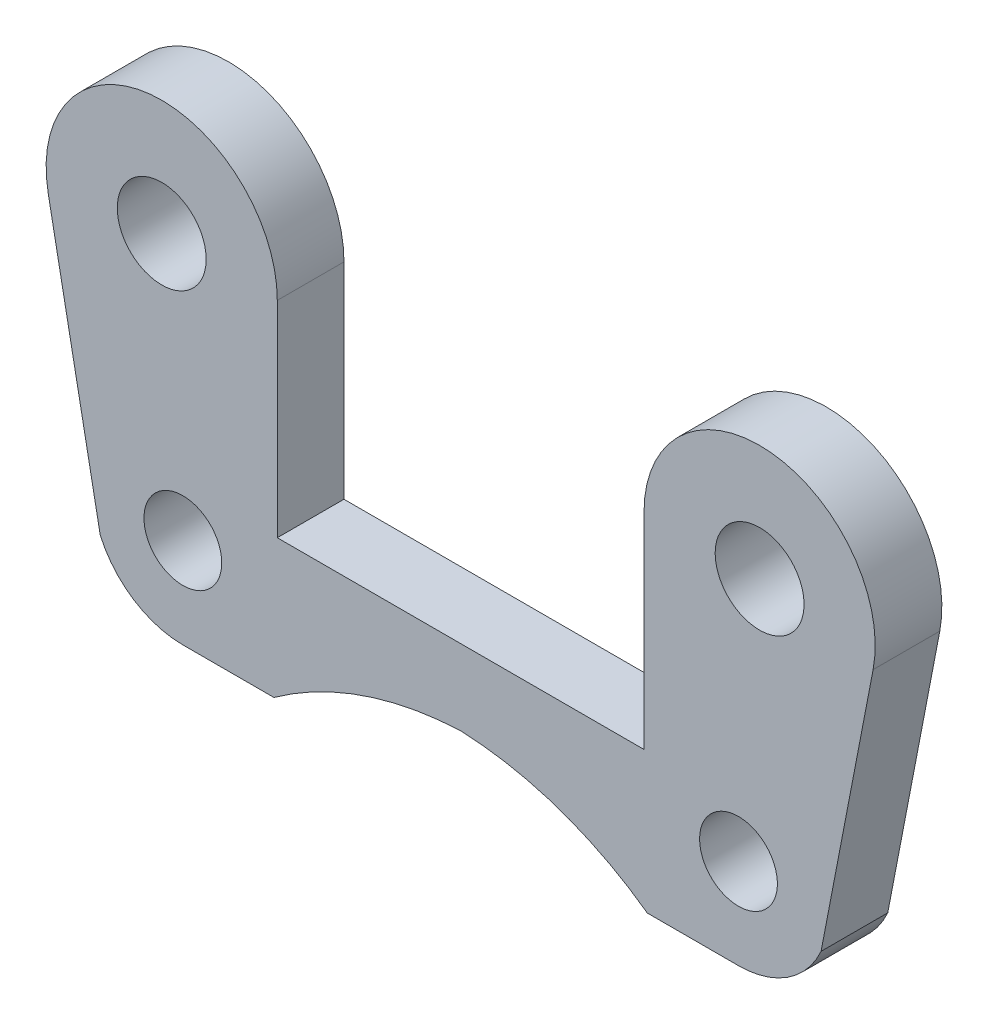
ISO-10303-21;
HEADER;
FILE_DESCRIPTION(('STEP AP214'),'2;1');
FILE_NAME('part.step','',(''),(''),'','','');
FILE_SCHEMA(('AUTOMOTIVE_DESIGN { 1 0 10303 214 1 1 1 1 }'));
ENDSEC;
DATA;
#1=APPLICATION_CONTEXT('core data for automotive mechanical design processes');
#2=APPLICATION_PROTOCOL_DEFINITION('international standard','automotive_design',2000,#1);
#3=PRODUCT_CONTEXT('',#1,'mechanical');
#4=PRODUCT('Part','Part','',(#3));
#5=PRODUCT_RELATED_PRODUCT_CATEGORY('part','',(#4));
#6=PRODUCT_DEFINITION_FORMATION('','',#4);
#7=PRODUCT_DEFINITION_CONTEXT('part definition',#1,'design');
#8=PRODUCT_DEFINITION('design','',#6,#7);
#9=PRODUCT_DEFINITION_SHAPE('','',#8);
#10=(LENGTH_UNIT() NAMED_UNIT(*) SI_UNIT(.MILLI.,.METRE.));
#11=(NAMED_UNIT(*) PLANE_ANGLE_UNIT() SI_UNIT($,.RADIAN.));
#12=(NAMED_UNIT(*) SI_UNIT($,.STERADIAN.) SOLID_ANGLE_UNIT());
#13=UNCERTAINTY_MEASURE_WITH_UNIT(LENGTH_MEASURE(1.E-05),#10,'distance_accuracy_value','');
#14=(GEOMETRIC_REPRESENTATION_CONTEXT(3) GLOBAL_UNCERTAINTY_ASSIGNED_CONTEXT((#13)) GLOBAL_UNIT_ASSIGNED_CONTEXT((#10,
#11,#12)) REPRESENTATION_CONTEXT('',''));
#15=CARTESIAN_POINT('',(0.,0.,0.));
#16=DIRECTION('',(0.,0.,1.));
#17=DIRECTION('',(1.,0.,0.));
#18=AXIS2_PLACEMENT_3D('',#15,#16,#17);
#19=CARTESIAN_POINT('',(-25.,-33.3691985578076,6.));
#20=DIRECTION('',(0.,0.,-1.));
#21=DIRECTION('',(-1.,0.,0.));
#22=AXIS2_PLACEMENT_3D('',#19,#20,#21);
#23=PLANE('',#22);
#24=CARTESIAN_POINT('',(-25.,-33.3691985578076,6.));
#25=DIRECTION('',(0.,0.,1.));
#26=DIRECTION('',(-1.,0.,0.));
#27=AXIS2_PLACEMENT_3D('',#24,#25,#26);
#28=CIRCLE('',#27,8.13080144219235);
#29=CARTESIAN_POINT('',(-32.431413249492,-36.6682937682604,6.));
#30=VERTEX_POINT('',#29);
#31=CARTESIAN_POINT('',(-25.,-41.5,6.));
#32=VERTEX_POINT('',#31);
#33=EDGE_CURVE('E185',#30,#32,#28,.T.);
#34=ORIENTED_EDGE('',*,*,#33,.T.);
#35=DIRECTION('',(1.,0.,0.));
#36=VECTOR('',#35,1.);
#37=CARTESIAN_POINT('',(-25.,-41.5,6.));
#38=LINE('',#37,#36);
#39=CARTESIAN_POINT('',(-16.8,-41.5,6.));
#40=VERTEX_POINT('',#39);
#41=EDGE_CURVE('E108',#32,#40,#38,.T.);
#42=ORIENTED_EDGE('',*,*,#41,.T.);
#43=CARTESIAN_POINT('',(1.20231787931905,-66.4136104090621,6.));
#44=DIRECTION('',(0.,0.,-1.));
#45=DIRECTION('',(1.,0.,0.));
#46=AXIS2_PLACEMENT_3D('',#43,#44,#45);
#47=CIRCLE('',#46,30.7371344247081);
#48=CARTESIAN_POINT('',(0.,-35.7,6.));
#49=VERTEX_POINT('',#48);
#50=EDGE_CURVE('E215',#40,#49,#47,.T.);
#51=ORIENTED_EDGE('',*,*,#50,.T.);
#52=CARTESIAN_POINT('',(-1.20231787931903,-66.4136104090621,6.));
#53=DIRECTION('',(0.,0.,-1.));
#54=DIRECTION('',(-1.,0.,0.));
#55=AXIS2_PLACEMENT_3D('',#52,#53,#54);
#56=CIRCLE('',#55,30.7371344247081);
#57=CARTESIAN_POINT('',(16.8,-41.5,6.));
#58=VERTEX_POINT('',#57);
#59=EDGE_CURVE('E234',#49,#58,#56,.T.);
#60=ORIENTED_EDGE('',*,*,#59,.T.);
#61=DIRECTION('',(1.,0.,0.));
#62=VECTOR('',#61,1.);
#63=CARTESIAN_POINT('',(25.,-41.5,6.));
#64=LINE('',#63,#62);
#65=CARTESIAN_POINT('',(25.,-41.5,6.));
#66=VERTEX_POINT('',#65);
#67=EDGE_CURVE('E231',#58,#66,#64,.T.);
#68=ORIENTED_EDGE('',*,*,#67,.T.);
#69=CARTESIAN_POINT('',(25.,-33.3691985578076,6.));
#70=DIRECTION('',(0.,0.,1.));
#71=DIRECTION('',(1.,0.,0.));
#72=AXIS2_PLACEMENT_3D('',#69,#70,#71);
#73=CIRCLE('',#72,8.13080144219235);
#74=CARTESIAN_POINT('',(32.431413249492,-36.6682937682604,6.));
#75=VERTEX_POINT('',#74);
#76=EDGE_CURVE('E233',#66,#75,#73,.T.);
#77=ORIENTED_EDGE('',*,*,#76,.T.);
#78=DIRECTION('',(0.189286162263998,0.98192196674449,0.));
#79=VECTOR('',#78,1.);
#80=CARTESIAN_POINT('',(32.431413249492,-36.6682937682604,6.));
#81=LINE('',#80,#79);
#82=CARTESIAN_POINT('',(37.1153117515257,-12.3705702889606,6.));
#83=VERTEX_POINT('',#82);
#84=EDGE_CURVE('E236',#75,#83,#81,.T.);
#85=ORIENTED_EDGE('',*,*,#84,.T.);
#86=CARTESIAN_POINT('',(26.901676805363,-10.401676805363,6.));
#87=DIRECTION('',(0.,0.,1.));
#88=DIRECTION('',(1.,0.,0.));
#89=AXIS2_PLACEMENT_3D('',#86,#87,#88);
#90=CIRCLE('',#89,10.401676805363);
#91=CARTESIAN_POINT('',(16.5,-10.401676805363,6.));
#92=VERTEX_POINT('',#91);
#93=EDGE_CURVE('E242',#83,#92,#90,.T.);
#94=ORIENTED_EDGE('',*,*,#93,.T.);
#95=DIRECTION('',(0.,-1.,0.));
#96=VECTOR('',#95,1.);
#97=CARTESIAN_POINT('',(16.5,-28.9,6.));
#98=LINE('',#97,#96);
#99=CARTESIAN_POINT('',(16.5,-28.9,6.));
#100=VERTEX_POINT('',#99);
#101=EDGE_CURVE('E244',#92,#100,#98,.T.);
#102=ORIENTED_EDGE('',*,*,#101,.T.);
#103=DIRECTION('',(-1.,0.,0.));
#104=VECTOR('',#103,1.);
#105=CARTESIAN_POINT('',(-16.5,-28.9,6.));
#106=LINE('',#105,#104);
#107=CARTESIAN_POINT('',(-16.5,-28.9,6.));
#108=VERTEX_POINT('',#107);
#109=EDGE_CURVE('E142',#100,#108,#106,.T.);
#110=ORIENTED_EDGE('',*,*,#109,.T.);
#111=DIRECTION('',(0.,1.,0.));
#112=VECTOR('',#111,1.);
#113=CARTESIAN_POINT('',(-16.5,-28.9,6.));
#114=LINE('',#113,#112);
#115=CARTESIAN_POINT('',(-16.5,-10.401676805363,6.));
#116=VERTEX_POINT('',#115);
#117=EDGE_CURVE('E136',#108,#116,#114,.T.);
#118=ORIENTED_EDGE('',*,*,#117,.T.);
#119=CARTESIAN_POINT('',(-26.901676805363,-10.401676805363,6.));
#120=DIRECTION('',(0.,0.,1.));
#121=DIRECTION('',(-1.,0.,0.));
#122=AXIS2_PLACEMENT_3D('',#119,#120,#121);
#123=CIRCLE('',#122,10.401676805363);
#124=CARTESIAN_POINT('',(-37.1153117515257,-12.3705702889606,6.));
#125=VERTEX_POINT('',#124);
#126=EDGE_CURVE('E140',#116,#125,#123,.T.);
#127=ORIENTED_EDGE('',*,*,#126,.T.);
#128=DIRECTION('',(0.189286162263998,-0.98192196674449,0.));
#129=VECTOR('',#128,1.);
#130=CARTESIAN_POINT('',(-32.431413249492,-36.6682937682604,6.));
#131=LINE('',#130,#129);
#132=EDGE_CURVE('E50',#125,#30,#131,.T.);
#133=ORIENTED_EDGE('',*,*,#132,.T.);
#134=EDGE_LOOP('',(#34,#42,#51,#60,#68,#77,#85,#94,#102,#110,#118,#127,#133));
#135=FACE_BOUND('',#134,.T.);
#136=CARTESIAN_POINT('',(-25.,-33.3691985578076,6.));
#137=DIRECTION('',(0.,0.,1.));
#138=DIRECTION('',(1.,0.,0.));
#139=AXIS2_PLACEMENT_3D('',#136,#137,#138);
#140=CIRCLE('',#139,3.5);
#141=CARTESIAN_POINT('',(-21.5,-33.3691985578076,6.));
#142=VERTEX_POINT('',#141);
#143=EDGE_CURVE('E164',#142,#142,#140,.T.);
#144=ORIENTED_EDGE('',*,*,#143,.F.);
#145=EDGE_LOOP('',(#144));
#146=FACE_BOUND('',#145,.T.);
#147=CARTESIAN_POINT('',(-26.901676805363,-10.401676805363,6.));
#148=DIRECTION('',(0.,0.,1.));
#149=DIRECTION('',(1.,0.,0.));
#150=AXIS2_PLACEMENT_3D('',#147,#148,#149);
#151=CIRCLE('',#150,4.);
#152=CARTESIAN_POINT('',(-22.901676805363,-10.401676805363,6.));
#153=VERTEX_POINT('',#152);
#154=EDGE_CURVE('E308',#153,#153,#151,.T.);
#155=ORIENTED_EDGE('',*,*,#154,.F.);
#156=EDGE_LOOP('',(#155));
#157=FACE_BOUND('',#156,.T.);
#158=CARTESIAN_POINT('',(25.,-33.3691985578076,6.));
#159=DIRECTION('',(0.,0.,1.));
#160=DIRECTION('',(-1.,0.,0.));
#161=AXIS2_PLACEMENT_3D('',#158,#159,#160);
#162=CIRCLE('',#161,3.5);
#163=CARTESIAN_POINT('',(21.5,-33.3691985578076,6.));
#164=VERTEX_POINT('',#163);
#165=EDGE_CURVE('E302',#164,#164,#162,.T.);
#166=ORIENTED_EDGE('',*,*,#165,.F.);
#167=EDGE_LOOP('',(#166));
#168=FACE_BOUND('',#167,.T.);
#169=CARTESIAN_POINT('',(26.901676805363,-10.401676805363,6.));
#170=DIRECTION('',(0.,0.,1.));
#171=DIRECTION('',(-1.,0.,0.));
#172=AXIS2_PLACEMENT_3D('',#169,#170,#171);
#173=CIRCLE('',#172,4.);
#174=CARTESIAN_POINT('',(22.901676805363,-10.401676805363,6.));
#175=VERTEX_POINT('',#174);
#176=EDGE_CURVE('E293',#175,#175,#173,.T.);
#177=ORIENTED_EDGE('',*,*,#176,.F.);
#178=EDGE_LOOP('',(#177));
#179=FACE_BOUND('',#178,.T.);
#180=ADVANCED_FACE('F33',(#135,#146,#157,#168,#179),#23,.F.);
#181=CARTESIAN_POINT('',(-25.,-33.3691985578076,0.));
#182=DIRECTION('',(0.,0.,-1.));
#183=DIRECTION('',(-1.,0.,0.));
#184=AXIS2_PLACEMENT_3D('',#181,#182,#183);
#185=PLANE('',#184);
#186=CARTESIAN_POINT('',(25.,-33.3691985578076,0.));
#187=DIRECTION('',(0.,0.,1.));
#188=DIRECTION('',(-1.,0.,0.));
#189=AXIS2_PLACEMENT_3D('',#186,#187,#188);
#190=CIRCLE('',#189,3.5);
#191=CARTESIAN_POINT('',(21.5,-33.3691985578076,0.));
#192=VERTEX_POINT('',#191);
#193=EDGE_CURVE('E299',#192,#192,#190,.T.);
#194=ORIENTED_EDGE('',*,*,#193,.T.);
#195=EDGE_LOOP('',(#194));
#196=FACE_BOUND('',#195,.T.);
#197=CARTESIAN_POINT('',(-25.,-33.3691985578076,0.));
#198=DIRECTION('',(0.,0.,1.));
#199=DIRECTION('',(1.,0.,0.));
#200=AXIS2_PLACEMENT_3D('',#197,#198,#199);
#201=CIRCLE('',#200,3.5);
#202=CARTESIAN_POINT('',(-21.5,-33.3691985578076,0.));
#203=VERTEX_POINT('',#202);
#204=EDGE_CURVE('E311',#203,#203,#201,.T.);
#205=ORIENTED_EDGE('',*,*,#204,.T.);
#206=EDGE_LOOP('',(#205));
#207=FACE_BOUND('',#206,.T.);
#208=CARTESIAN_POINT('',(-25.,-33.3691985578076,0.));
#209=DIRECTION('',(0.,0.,1.));
#210=DIRECTION('',(-1.,0.,0.));
#211=AXIS2_PLACEMENT_3D('',#208,#209,#210);
#212=CIRCLE('',#211,8.13080144219235);
#213=CARTESIAN_POINT('',(-32.431413249492,-36.6682937682604,0.));
#214=VERTEX_POINT('',#213);
#215=CARTESIAN_POINT('',(-25.,-41.5,0.));
#216=VERTEX_POINT('',#215);
#217=EDGE_CURVE('E160',#214,#216,#212,.T.);
#218=ORIENTED_EDGE('',*,*,#217,.F.);
#219=DIRECTION('',(0.189286162263998,-0.98192196674449,0.));
#220=VECTOR('',#219,1.);
#221=CARTESIAN_POINT('',(-32.431413249492,-36.6682937682604,0.));
#222=LINE('',#221,#220);
#223=CARTESIAN_POINT('',(-37.1153117515257,-12.3705702889606,0.));
#224=VERTEX_POINT('',#223);
#225=EDGE_CURVE('E100',#224,#214,#222,.T.);
#226=ORIENTED_EDGE('',*,*,#225,.F.);
#227=CARTESIAN_POINT('',(-26.901676805363,-10.401676805363,0.));
#228=DIRECTION('',(0.,0.,1.));
#229=DIRECTION('',(-1.,0.,0.));
#230=AXIS2_PLACEMENT_3D('',#227,#228,#229);
#231=CIRCLE('',#230,10.401676805363);
#232=CARTESIAN_POINT('',(-16.5,-10.401676805363,0.));
#233=VERTEX_POINT('',#232);
#234=EDGE_CURVE('E94',#233,#224,#231,.T.);
#235=ORIENTED_EDGE('',*,*,#234,.F.);
#236=DIRECTION('',(0.,1.,0.));
#237=VECTOR('',#236,1.);
#238=CARTESIAN_POINT('',(-16.5,-28.9,0.));
#239=LINE('',#238,#237);
#240=CARTESIAN_POINT('',(-16.5,-28.9,0.));
#241=VERTEX_POINT('',#240);
#242=EDGE_CURVE('E150',#241,#233,#239,.T.);
#243=ORIENTED_EDGE('',*,*,#242,.F.);
#244=DIRECTION('',(-1.,0.,0.));
#245=VECTOR('',#244,1.);
#246=CARTESIAN_POINT('',(-16.5,-28.9,0.));
#247=LINE('',#246,#245);
#248=CARTESIAN_POINT('',(16.5,-28.9,0.));
#249=VERTEX_POINT('',#248);
#250=EDGE_CURVE('E180',#249,#241,#247,.T.);
#251=ORIENTED_EDGE('',*,*,#250,.F.);
#252=DIRECTION('',(0.,-1.,0.));
#253=VECTOR('',#252,1.);
#254=CARTESIAN_POINT('',(16.5,-28.9,0.));
#255=LINE('',#254,#253);
#256=CARTESIAN_POINT('',(16.5,-10.401676805363,0.));
#257=VERTEX_POINT('',#256);
#258=EDGE_CURVE('E178',#257,#249,#255,.T.);
#259=ORIENTED_EDGE('',*,*,#258,.F.);
#260=CARTESIAN_POINT('',(26.901676805363,-10.401676805363,0.));
#261=DIRECTION('',(0.,0.,1.));
#262=DIRECTION('',(1.,0.,0.));
#263=AXIS2_PLACEMENT_3D('',#260,#261,#262);
#264=CIRCLE('',#263,10.401676805363);
#265=CARTESIAN_POINT('',(37.1153117515257,-12.3705702889606,0.));
#266=VERTEX_POINT('',#265);
#267=EDGE_CURVE('E176',#266,#257,#264,.T.);
#268=ORIENTED_EDGE('',*,*,#267,.F.);
#269=DIRECTION('',(0.189286162263998,0.98192196674449,0.));
#270=VECTOR('',#269,1.);
#271=CARTESIAN_POINT('',(32.431413249492,-36.6682937682604,0.));
#272=LINE('',#271,#270);
#273=CARTESIAN_POINT('',(32.431413249492,-36.6682937682604,0.));
#274=VERTEX_POINT('',#273);
#275=EDGE_CURVE('E174',#274,#266,#272,.T.);
#276=ORIENTED_EDGE('',*,*,#275,.F.);
#277=CARTESIAN_POINT('',(25.,-33.3691985578076,0.));
#278=DIRECTION('',(0.,0.,1.));
#279=DIRECTION('',(1.,0.,0.));
#280=AXIS2_PLACEMENT_3D('',#277,#278,#279);
#281=CIRCLE('',#280,8.13080144219235);
#282=CARTESIAN_POINT('',(25.,-41.5,0.));
#283=VERTEX_POINT('',#282);
#284=EDGE_CURVE('E172',#283,#274,#281,.T.);
#285=ORIENTED_EDGE('',*,*,#284,.F.);
#286=DIRECTION('',(1.,0.,0.));
#287=VECTOR('',#286,1.);
#288=CARTESIAN_POINT('',(25.,-41.5,0.));
#289=LINE('',#288,#287);
#290=CARTESIAN_POINT('',(16.8,-41.5,0.));
#291=VERTEX_POINT('',#290);
#292=EDGE_CURVE('E170',#291,#283,#289,.T.);
#293=ORIENTED_EDGE('',*,*,#292,.F.);
#294=CARTESIAN_POINT('',(-1.20231787931903,-66.4136104090621,0.));
#295=DIRECTION('',(0.,0.,-1.));
#296=DIRECTION('',(-1.,0.,0.));
#297=AXIS2_PLACEMENT_3D('',#294,#295,#296);
#298=CIRCLE('',#297,30.7371344247081);
#299=CARTESIAN_POINT('',(0.,-35.7,0.));
#300=VERTEX_POINT('',#299);
#301=EDGE_CURVE('E168',#300,#291,#298,.T.);
#302=ORIENTED_EDGE('',*,*,#301,.F.);
#303=CARTESIAN_POINT('',(1.20231787931905,-66.4136104090621,0.));
#304=DIRECTION('',(0.,0.,-1.));
#305=DIRECTION('',(1.,0.,0.));
#306=AXIS2_PLACEMENT_3D('',#303,#304,#305);
#307=CIRCLE('',#306,30.7371344247081);
#308=CARTESIAN_POINT('',(-16.8,-41.5,0.));
#309=VERTEX_POINT('',#308);
#310=EDGE_CURVE('E166',#309,#300,#307,.T.);
#311=ORIENTED_EDGE('',*,*,#310,.F.);
#312=DIRECTION('',(1.,0.,0.));
#313=VECTOR('',#312,1.);
#314=CARTESIAN_POINT('',(-25.,-41.5,0.));
#315=LINE('',#314,#313);
#316=EDGE_CURVE('E163',#216,#309,#315,.T.);
#317=ORIENTED_EDGE('',*,*,#316,.F.);
#318=EDGE_LOOP('',(#218,#226,#235,#243,#251,#259,#268,#276,#285,#293,#302,#311,#317));
#319=FACE_BOUND('',#318,.T.);
#320=CARTESIAN_POINT('',(-26.901676805363,-10.401676805363,0.));
#321=DIRECTION('',(0.,0.,1.));
#322=DIRECTION('',(1.,0.,0.));
#323=AXIS2_PLACEMENT_3D('',#320,#321,#322);
#324=CIRCLE('',#323,4.);
#325=CARTESIAN_POINT('',(-22.901676805363,-10.401676805363,0.));
#326=VERTEX_POINT('',#325);
#327=EDGE_CURVE('E305',#326,#326,#324,.T.);
#328=ORIENTED_EDGE('',*,*,#327,.T.);
#329=EDGE_LOOP('',(#328));
#330=FACE_BOUND('',#329,.T.);
#331=CARTESIAN_POINT('',(26.901676805363,-10.401676805363,0.));
#332=DIRECTION('',(0.,0.,1.));
#333=DIRECTION('',(-1.,0.,0.));
#334=AXIS2_PLACEMENT_3D('',#331,#332,#333);
#335=CIRCLE('',#334,4.);
#336=CARTESIAN_POINT('',(22.901676805363,-10.401676805363,0.));
#337=VERTEX_POINT('',#336);
#338=EDGE_CURVE('E296',#337,#337,#335,.T.);
#339=ORIENTED_EDGE('',*,*,#338,.T.);
#340=EDGE_LOOP('',(#339));
#341=FACE_BOUND('',#340,.T.);
#342=ADVANCED_FACE('F219',(#196,#207,#319,#330,#341),#185,.T.);
#343=CARTESIAN_POINT('',(-25.,-33.3691985578076,6.));
#344=DIRECTION('',(0.,0.,-1.));
#345=DIRECTION('',(-1.,0.,0.));
#346=AXIS2_PLACEMENT_3D('',#343,#344,#345);
#347=CYLINDRICAL_SURFACE('',#346,8.13080144219235);
#348=ORIENTED_EDGE('',*,*,#217,.T.);
#349=DIRECTION('',(0.,0.,-1.));
#350=VECTOR('',#349,1.);
#351=CARTESIAN_POINT('',(-25.,-41.5,6.));
#352=LINE('',#351,#350);
#353=EDGE_CURVE('E11',#32,#216,#352,.T.);
#354=ORIENTED_EDGE('',*,*,#353,.F.);
#355=ORIENTED_EDGE('',*,*,#33,.F.);
#356=DIRECTION('',(0.,0.,-1.));
#357=VECTOR('',#356,1.);
#358=CARTESIAN_POINT('',(-32.431413249492,-36.6682937682604,6.));
#359=LINE('',#358,#357);
#360=EDGE_CURVE('E156',#30,#214,#359,.T.);
#361=ORIENTED_EDGE('',*,*,#360,.T.);
#362=EDGE_LOOP('',(#348,#354,#355,#361));
#363=FACE_BOUND('',#362,.T.);
#364=ADVANCED_FACE('F35',(#363),#347,.T.);
#365=CARTESIAN_POINT('',(-25.,-41.5,6.));
#366=DIRECTION('',(0.,1.,0.));
#367=DIRECTION('',(0.,0.,1.));
#368=AXIS2_PLACEMENT_3D('',#365,#366,#367);
#369=PLANE('',#368);
#370=ORIENTED_EDGE('',*,*,#316,.T.);
#371=DIRECTION('',(0.,0.,-1.));
#372=VECTOR('',#371,1.);
#373=CARTESIAN_POINT('',(-16.8,-41.5,6.));
#374=LINE('',#373,#372);
#375=EDGE_CURVE('E42',#40,#309,#374,.T.);
#376=ORIENTED_EDGE('',*,*,#375,.F.);
#377=ORIENTED_EDGE('',*,*,#41,.F.);
#378=ORIENTED_EDGE('',*,*,#353,.T.);
#379=EDGE_LOOP('',(#370,#376,#377,#378));
#380=FACE_BOUND('',#379,.T.);
#381=ADVANCED_FACE('F433',(#380),#369,.F.);
#382=CARTESIAN_POINT('',(1.20231787931905,-66.4136104090621,6.));
#383=DIRECTION('',(0.,0.,-1.));
#384=DIRECTION('',(-1.,0.,0.));
#385=AXIS2_PLACEMENT_3D('',#382,#383,#384);
#386=CYLINDRICAL_SURFACE('',#385,30.7371344247081);
#387=ORIENTED_EDGE('',*,*,#310,.T.);
#388=DIRECTION('',(0.,0.,-1.));
#389=VECTOR('',#388,1.);
#390=CARTESIAN_POINT('',(0.,-35.7,6.));
#391=LINE('',#390,#389);
#392=EDGE_CURVE('E207',#49,#300,#391,.T.);
#393=ORIENTED_EDGE('',*,*,#392,.F.);
#394=ORIENTED_EDGE('',*,*,#50,.F.);
#395=ORIENTED_EDGE('',*,*,#375,.T.);
#396=EDGE_LOOP('',(#387,#393,#394,#395));
#397=FACE_BOUND('',#396,.T.);
#398=ADVANCED_FACE('F213',(#397),#386,.F.);
#399=CARTESIAN_POINT('',(-1.20231787931903,-66.4136104090621,6.));
#400=DIRECTION('',(0.,0.,-1.));
#401=DIRECTION('',(-1.,0.,0.));
#402=AXIS2_PLACEMENT_3D('',#399,#400,#401);
#403=CYLINDRICAL_SURFACE('',#402,30.7371344247081);
#404=ORIENTED_EDGE('',*,*,#301,.T.);
#405=DIRECTION('',(0.,0.,-1.));
#406=VECTOR('',#405,1.);
#407=CARTESIAN_POINT('',(16.8,-41.5,6.));
#408=LINE('',#407,#406);
#409=EDGE_CURVE('E204',#58,#291,#408,.T.);
#410=ORIENTED_EDGE('',*,*,#409,.F.);
#411=ORIENTED_EDGE('',*,*,#59,.F.);
#412=ORIENTED_EDGE('',*,*,#392,.T.);
#413=EDGE_LOOP('',(#404,#410,#411,#412));
#414=FACE_BOUND('',#413,.T.);
#415=ADVANCED_FACE('F225',(#414),#403,.F.);
#416=CARTESIAN_POINT('',(25.,-41.5,6.));
#417=DIRECTION('',(0.,1.,0.));
#418=DIRECTION('',(-1.,0.,0.));
#419=AXIS2_PLACEMENT_3D('',#416,#417,#418);
#420=PLANE('',#419);
#421=ORIENTED_EDGE('',*,*,#292,.T.);
#422=DIRECTION('',(0.,0.,-1.));
#423=VECTOR('',#422,1.);
#424=CARTESIAN_POINT('',(25.,-41.5,6.));
#425=LINE('',#424,#423);
#426=EDGE_CURVE('E201',#66,#283,#425,.T.);
#427=ORIENTED_EDGE('',*,*,#426,.F.);
#428=ORIENTED_EDGE('',*,*,#67,.F.);
#429=ORIENTED_EDGE('',*,*,#409,.T.);
#430=EDGE_LOOP('',(#421,#427,#428,#429));
#431=FACE_BOUND('',#430,.T.);
#432=ADVANCED_FACE('F229',(#431),#420,.F.);
#433=CARTESIAN_POINT('',(25.,-33.3691985578076,6.));
#434=DIRECTION('',(0.,0.,-1.));
#435=DIRECTION('',(-1.,0.,0.));
#436=AXIS2_PLACEMENT_3D('',#433,#434,#435);
#437=CYLINDRICAL_SURFACE('',#436,8.13080144219235);
#438=ORIENTED_EDGE('',*,*,#284,.T.);
#439=DIRECTION('',(0.,0.,-1.));
#440=VECTOR('',#439,1.);
#441=CARTESIAN_POINT('',(32.431413249492,-36.6682937682604,6.));
#442=LINE('',#441,#440);
#443=EDGE_CURVE('E198',#75,#274,#442,.T.);
#444=ORIENTED_EDGE('',*,*,#443,.F.);
#445=ORIENTED_EDGE('',*,*,#76,.F.);
#446=ORIENTED_EDGE('',*,*,#426,.T.);
#447=EDGE_LOOP('',(#438,#444,#445,#446));
#448=FACE_BOUND('',#447,.T.);
#449=ADVANCED_FACE('F398',(#448),#437,.T.);
#450=CARTESIAN_POINT('',(32.431413249492,-36.6682937682604,6.));
#451=DIRECTION('',(-0.98192196674449,0.189286162263998,0.));
#452=DIRECTION('',(-0.189286162263998,-0.98192196674449,0.));
#453=AXIS2_PLACEMENT_3D('',#450,#451,#452);
#454=PLANE('',#453);
#455=ORIENTED_EDGE('',*,*,#275,.T.);
#456=DIRECTION('',(0.,0.,-1.));
#457=VECTOR('',#456,1.);
#458=CARTESIAN_POINT('',(37.1153117515257,-12.3705702889606,6.));
#459=LINE('',#458,#457);
#460=EDGE_CURVE('E195',#83,#266,#459,.T.);
#461=ORIENTED_EDGE('',*,*,#460,.F.);
#462=ORIENTED_EDGE('',*,*,#84,.F.);
#463=ORIENTED_EDGE('',*,*,#443,.T.);
#464=EDGE_LOOP('',(#455,#461,#462,#463));
#465=FACE_BOUND('',#464,.T.);
#466=ADVANCED_FACE('F388',(#465),#454,.F.);
#467=CARTESIAN_POINT('',(26.901676805363,-10.401676805363,6.));
#468=DIRECTION('',(0.,0.,-1.));
#469=DIRECTION('',(-1.,0.,0.));
#470=AXIS2_PLACEMENT_3D('',#467,#468,#469);
#471=CYLINDRICAL_SURFACE('',#470,10.401676805363);
#472=ORIENTED_EDGE('',*,*,#267,.T.);
#473=DIRECTION('',(0.,0.,-1.));
#474=VECTOR('',#473,1.);
#475=CARTESIAN_POINT('',(16.5,-10.401676805363,6.));
#476=LINE('',#475,#474);
#477=EDGE_CURVE('E192',#92,#257,#476,.T.);
#478=ORIENTED_EDGE('',*,*,#477,.F.);
#479=ORIENTED_EDGE('',*,*,#93,.F.);
#480=ORIENTED_EDGE('',*,*,#460,.T.);
#481=EDGE_LOOP('',(#472,#478,#479,#480));
#482=FACE_BOUND('',#481,.T.);
#483=ADVANCED_FACE('F379',(#482),#471,.T.);
#484=CARTESIAN_POINT('',(16.5,-28.9,6.));
#485=DIRECTION('',(1.,0.,0.));
#486=DIRECTION('',(0.,1.,0.));
#487=AXIS2_PLACEMENT_3D('',#484,#485,#486);
#488=PLANE('',#487);
#489=ORIENTED_EDGE('',*,*,#258,.T.);
#490=DIRECTION('',(0.,0.,-1.));
#491=VECTOR('',#490,1.);
#492=CARTESIAN_POINT('',(16.5,-28.9,6.));
#493=LINE('',#492,#491);
#494=EDGE_CURVE('E189',#100,#249,#493,.T.);
#495=ORIENTED_EDGE('',*,*,#494,.F.);
#496=ORIENTED_EDGE('',*,*,#101,.F.);
#497=ORIENTED_EDGE('',*,*,#477,.T.);
#498=EDGE_LOOP('',(#489,#495,#496,#497));
#499=FACE_BOUND('',#498,.T.);
#500=ADVANCED_FACE('F250',(#499),#488,.F.);
#501=CARTESIAN_POINT('',(-16.5,-28.9,6.));
#502=DIRECTION('',(0.,-1.,0.));
#503=DIRECTION('',(1.,0.,0.));
#504=AXIS2_PLACEMENT_3D('',#501,#502,#503);
#505=PLANE('',#504);
#506=ORIENTED_EDGE('',*,*,#250,.T.);
#507=DIRECTION('',(0.,0.,-1.));
#508=VECTOR('',#507,1.);
#509=CARTESIAN_POINT('',(-16.5,-28.9,6.));
#510=LINE('',#509,#508);
#511=EDGE_CURVE('E151',#108,#241,#510,.T.);
#512=ORIENTED_EDGE('',*,*,#511,.F.);
#513=ORIENTED_EDGE('',*,*,#109,.F.);
#514=ORIENTED_EDGE('',*,*,#494,.T.);
#515=EDGE_LOOP('',(#506,#512,#513,#514));
#516=FACE_BOUND('',#515,.T.);
#517=ADVANCED_FACE('F254',(#516),#505,.F.);
#518=CARTESIAN_POINT('',(-16.5,-28.9,6.));
#519=DIRECTION('',(-1.,0.,0.));
#520=DIRECTION('',(0.,-1.,0.));
#521=AXIS2_PLACEMENT_3D('',#518,#519,#520);
#522=PLANE('',#521);
#523=ORIENTED_EDGE('',*,*,#242,.T.);
#524=DIRECTION('',(0.,0.,-1.));
#525=VECTOR('',#524,1.);
#526=CARTESIAN_POINT('',(-16.5,-10.401676805363,6.));
#527=LINE('',#526,#525);
#528=EDGE_CURVE('E147',#116,#233,#527,.T.);
#529=ORIENTED_EDGE('',*,*,#528,.F.);
#530=ORIENTED_EDGE('',*,*,#117,.F.);
#531=ORIENTED_EDGE('',*,*,#511,.T.);
#532=EDGE_LOOP('',(#523,#529,#530,#531));
#533=FACE_BOUND('',#532,.T.);
#534=ADVANCED_FACE('F148',(#533),#522,.F.);
#535=CARTESIAN_POINT('',(-26.901676805363,-10.401676805363,6.));
#536=DIRECTION('',(0.,0.,-1.));
#537=DIRECTION('',(-1.,0.,0.));
#538=AXIS2_PLACEMENT_3D('',#535,#536,#537);
#539=CYLINDRICAL_SURFACE('',#538,10.401676805363);
#540=ORIENTED_EDGE('',*,*,#234,.T.);
#541=DIRECTION('',(0.,0.,-1.));
#542=VECTOR('',#541,1.);
#543=CARTESIAN_POINT('',(-37.1153117515257,-12.3705702889606,6.));
#544=LINE('',#543,#542);
#545=EDGE_CURVE('E152',#125,#224,#544,.T.);
#546=ORIENTED_EDGE('',*,*,#545,.F.);
#547=ORIENTED_EDGE('',*,*,#126,.F.);
#548=ORIENTED_EDGE('',*,*,#528,.T.);
#549=EDGE_LOOP('',(#540,#546,#547,#548));
#550=FACE_BOUND('',#549,.T.);
#551=ADVANCED_FACE('F154',(#550),#539,.T.);
#552=CARTESIAN_POINT('',(-32.431413249492,-36.6682937682604,6.));
#553=DIRECTION('',(0.98192196674449,0.189286162263998,0.));
#554=DIRECTION('',(-0.189286162263998,0.98192196674449,0.));
#555=AXIS2_PLACEMENT_3D('',#552,#553,#554);
#556=PLANE('',#555);
#557=ORIENTED_EDGE('',*,*,#225,.T.);
#558=ORIENTED_EDGE('',*,*,#360,.F.);
#559=ORIENTED_EDGE('',*,*,#132,.F.);
#560=ORIENTED_EDGE('',*,*,#545,.T.);
#561=EDGE_LOOP('',(#557,#558,#559,#560));
#562=FACE_BOUND('',#561,.T.);
#563=ADVANCED_FACE('F258',(#562),#556,.F.);
#564=CARTESIAN_POINT('',(-25.,-33.3691985578076,6.));
#565=DIRECTION('',(0.,0.,-1.));
#566=DIRECTION('',(-1.,0.,0.));
#567=AXIS2_PLACEMENT_3D('',#564,#565,#566);
#568=CYLINDRICAL_SURFACE('',#567,3.5);
#569=ORIENTED_EDGE('',*,*,#143,.T.);
#570=EDGE_LOOP('',(#569));
#571=FACE_BOUND('',#570,.T.);
#572=ORIENTED_EDGE('',*,*,#204,.F.);
#573=EDGE_LOOP('',(#572));
#574=FACE_BOUND('',#573,.T.);
#575=ADVANCED_FACE('F260',(#571,#574),#568,.F.);
#576=CARTESIAN_POINT('',(-26.901676805363,-10.401676805363,6.));
#577=DIRECTION('',(0.,0.,-1.));
#578=DIRECTION('',(-1.,0.,0.));
#579=AXIS2_PLACEMENT_3D('',#576,#577,#578);
#580=CYLINDRICAL_SURFACE('',#579,4.);
#581=ORIENTED_EDGE('',*,*,#154,.T.);
#582=EDGE_LOOP('',(#581));
#583=FACE_BOUND('',#582,.T.);
#584=ORIENTED_EDGE('',*,*,#327,.F.);
#585=EDGE_LOOP('',(#584));
#586=FACE_BOUND('',#585,.T.);
#587=ADVANCED_FACE('F266',(#583,#586),#580,.F.);
#588=CARTESIAN_POINT('',(25.,-33.3691985578076,6.));
#589=DIRECTION('',(0.,0.,-1.));
#590=DIRECTION('',(-1.,0.,0.));
#591=AXIS2_PLACEMENT_3D('',#588,#589,#590);
#592=CYLINDRICAL_SURFACE('',#591,3.5);
#593=ORIENTED_EDGE('',*,*,#165,.T.);
#594=EDGE_LOOP('',(#593));
#595=FACE_BOUND('',#594,.T.);
#596=ORIENTED_EDGE('',*,*,#193,.F.);
#597=EDGE_LOOP('',(#596));
#598=FACE_BOUND('',#597,.T.);
#599=ADVANCED_FACE('F280',(#595,#598),#592,.F.);
#600=CARTESIAN_POINT('',(26.901676805363,-10.401676805363,6.));
#601=DIRECTION('',(0.,0.,-1.));
#602=DIRECTION('',(-1.,0.,0.));
#603=AXIS2_PLACEMENT_3D('',#600,#601,#602);
#604=CYLINDRICAL_SURFACE('',#603,4.);
#605=ORIENTED_EDGE('',*,*,#176,.T.);
#606=EDGE_LOOP('',(#605));
#607=FACE_BOUND('',#606,.T.);
#608=ORIENTED_EDGE('',*,*,#338,.F.);
#609=EDGE_LOOP('',(#608));
#610=FACE_BOUND('',#609,.T.);
#611=ADVANCED_FACE('F284',(#607,#610),#604,.F.);
#612=CLOSED_SHELL('',(#180,#342,#364,#381,#398,#415,#432,#449,#466,#483,#500,#517,#534,#551,
#563,#575,#587,#599,#611));
#613=MANIFOLD_SOLID_BREP('B2',#612);
#614=ADVANCED_BREP_SHAPE_REPRESENTATION('',(#18,#613),#14);
#615=SHAPE_DEFINITION_REPRESENTATION(#9,#614);
ENDSEC;
END-ISO-10303-21;
